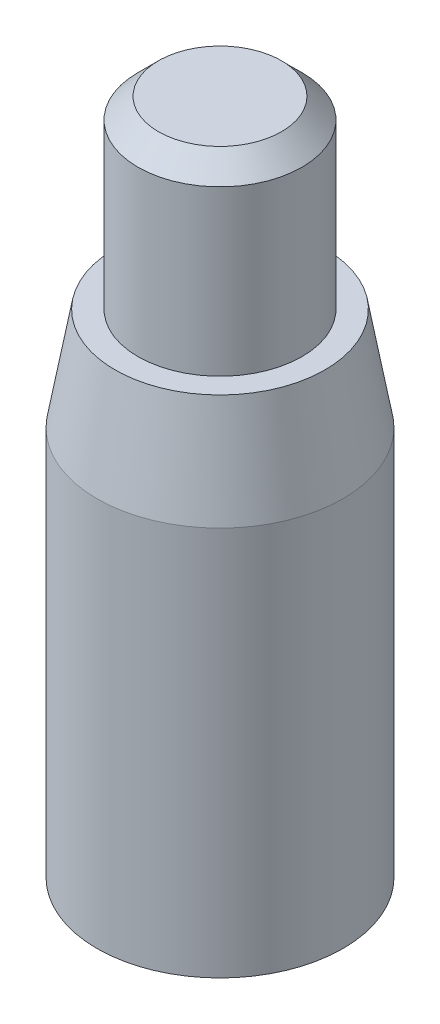
ISO-10303-21;
HEADER;
FILE_DESCRIPTION(('STEP AP214'),'2;1');
FILE_NAME('part.step','',(''),(''),'','','');
FILE_SCHEMA(('AUTOMOTIVE_DESIGN { 1 0 10303 214 1 1 1 1 }'));
ENDSEC;
DATA;
#1=APPLICATION_CONTEXT('core data for automotive mechanical design processes');
#2=APPLICATION_PROTOCOL_DEFINITION('international standard','automotive_design',2000,#1);
#3=PRODUCT_CONTEXT('',#1,'mechanical');
#4=PRODUCT('Part','Part','',(#3));
#5=PRODUCT_RELATED_PRODUCT_CATEGORY('part','',(#4));
#6=PRODUCT_DEFINITION_FORMATION('','',#4);
#7=PRODUCT_DEFINITION_CONTEXT('part definition',#1,'design');
#8=PRODUCT_DEFINITION('design','',#6,#7);
#9=PRODUCT_DEFINITION_SHAPE('','',#8);
#10=(LENGTH_UNIT() NAMED_UNIT(*) SI_UNIT(.MILLI.,.METRE.));
#11=(NAMED_UNIT(*) PLANE_ANGLE_UNIT() SI_UNIT($,.RADIAN.));
#12=(NAMED_UNIT(*) SI_UNIT($,.STERADIAN.) SOLID_ANGLE_UNIT());
#13=UNCERTAINTY_MEASURE_WITH_UNIT(LENGTH_MEASURE(1.E-05),#10,'distance_accuracy_value','');
#14=(GEOMETRIC_REPRESENTATION_CONTEXT(3) GLOBAL_UNCERTAINTY_ASSIGNED_CONTEXT((#13)) GLOBAL_UNIT_ASSIGNED_CONTEXT((#10,
#11,#12)) REPRESENTATION_CONTEXT('',''));
#15=CARTESIAN_POINT('',(0.,0.,0.));
#16=DIRECTION('',(0.,0.,1.));
#17=DIRECTION('',(1.,0.,0.));
#18=AXIS2_PLACEMENT_3D('',#15,#16,#17);
#19=CARTESIAN_POINT('',(0.,0.,0.));
#20=DIRECTION('',(0.,-1.,0.));
#21=DIRECTION('',(0.,0.,-1.));
#22=AXIS2_PLACEMENT_3D('',#19,#20,#21);
#23=PLANE('',#22);
#24=CARTESIAN_POINT('',(0.,0.,0.));
#25=DIRECTION('',(0.,-1.,0.));
#26=DIRECTION('',(0.,0.,-1.));
#27=AXIS2_PLACEMENT_3D('',#24,#25,#26);
#28=CIRCLE('',#27,6.);
#29=CARTESIAN_POINT('',(0.,0.,-6.));
#30=VERTEX_POINT('',#29);
#31=EDGE_CURVE('E47',#30,#30,#28,.T.);
#32=ORIENTED_EDGE('',*,*,#31,.T.);
#33=EDGE_LOOP('',(#32));
#34=FACE_BOUND('',#33,.T.);
#35=ADVANCED_FACE('F37',(#34),#23,.T.);
#36=CARTESIAN_POINT('',(0.,0.,0.));
#37=DIRECTION('',(0.,-1.,0.));
#38=DIRECTION('',(0.,0.,-1.));
#39=AXIS2_PLACEMENT_3D('',#36,#37,#38);
#40=CYLINDRICAL_SURFACE('',#39,6.);
#41=CARTESIAN_POINT('',(0.,19.,0.));
#42=DIRECTION('',(0.,-1.,0.));
#43=DIRECTION('',(0.,0.,-1.));
#44=AXIS2_PLACEMENT_3D('',#41,#42,#43);
#45=CIRCLE('',#44,6.);
#46=CARTESIAN_POINT('',(0.,19.,-6.));
#47=VERTEX_POINT('',#46);
#48=EDGE_CURVE('E51',#47,#47,#45,.T.);
#49=ORIENTED_EDGE('',*,*,#48,.T.);
#50=EDGE_LOOP('',(#49));
#51=FACE_BOUND('',#50,.T.);
#52=ORIENTED_EDGE('',*,*,#31,.F.);
#53=EDGE_LOOP('',(#52));
#54=FACE_BOUND('',#53,.T.);
#55=ADVANCED_FACE('F79',(#51,#54),#40,.T.);
#56=CARTESIAN_POINT('',(0.,19.,0.));
#57=DIRECTION('',(0.,-1.,0.));
#58=DIRECTION('',(0.,0.,-1.));
#59=AXIS2_PLACEMENT_3D('',#56,#57,#58);
#60=CONICAL_SURFACE('',#59,6.,0.174532925199434);
#61=CARTESIAN_POINT('',(0.,24.,0.));
#62=DIRECTION('',(0.,-1.,0.));
#63=DIRECTION('',(0.,0.,-1.));
#64=AXIS2_PLACEMENT_3D('',#61,#62,#63);
#65=CIRCLE('',#64,5.11836509645767);
#66=CARTESIAN_POINT('',(0.,24.,-5.11836509645767));
#67=VERTEX_POINT('',#66);
#68=EDGE_CURVE('E56',#67,#67,#65,.T.);
#69=ORIENTED_EDGE('',*,*,#68,.T.);
#70=EDGE_LOOP('',(#69));
#71=FACE_BOUND('',#70,.T.);
#72=ORIENTED_EDGE('',*,*,#48,.F.);
#73=EDGE_LOOP('',(#72));
#74=FACE_BOUND('',#73,.T.);
#75=ADVANCED_FACE('F76',(#71,#74),#60,.T.);
#76=CARTESIAN_POINT('',(4.00000000000001,24.,0.));
#77=DIRECTION('',(0.,1.,0.));
#78=DIRECTION('',(0.,0.,1.));
#79=AXIS2_PLACEMENT_3D('',#76,#77,#78);
#80=PLANE('',#79);
#81=CARTESIAN_POINT('',(0.,24.,0.));
#82=DIRECTION('',(0.,-1.,0.));
#83=DIRECTION('',(0.,0.,-1.));
#84=AXIS2_PLACEMENT_3D('',#81,#82,#83);
#85=CIRCLE('',#84,4.00000000000001);
#86=CARTESIAN_POINT('',(0.,24.,-4.00000000000001));
#87=VERTEX_POINT('',#86);
#88=EDGE_CURVE('E59',#87,#87,#85,.T.);
#89=ORIENTED_EDGE('',*,*,#88,.T.);
#90=EDGE_LOOP('',(#89));
#91=FACE_BOUND('',#90,.T.);
#92=ORIENTED_EDGE('',*,*,#68,.F.);
#93=EDGE_LOOP('',(#92));
#94=FACE_BOUND('',#93,.T.);
#95=ADVANCED_FACE('F63',(#91,#94),#80,.T.);
#96=CARTESIAN_POINT('',(0.,0.,0.));
#97=DIRECTION('',(0.,-1.,0.));
#98=DIRECTION('',(0.,0.,-1.));
#99=AXIS2_PLACEMENT_3D('',#96,#97,#98);
#100=CYLINDRICAL_SURFACE('',#99,4.00000000000001);
#101=CARTESIAN_POINT('',(0.,32.,0.));
#102=DIRECTION('',(0.,1.,0.));
#103=DIRECTION('',(0.,0.,1.));
#104=AXIS2_PLACEMENT_3D('',#101,#102,#103);
#105=CIRCLE('',#104,4.00000000000001);
#106=CARTESIAN_POINT('',(0.,32.,4.00000000000001));
#107=VERTEX_POINT('',#106);
#108=EDGE_CURVE('E43',#107,#107,#105,.F.);
#109=ORIENTED_EDGE('',*,*,#108,.T.);
#110=EDGE_LOOP('',(#109));
#111=FACE_BOUND('',#110,.T.);
#112=ORIENTED_EDGE('',*,*,#88,.F.);
#113=EDGE_LOOP('',(#112));
#114=FACE_BOUND('',#113,.T.);
#115=ADVANCED_FACE('F66',(#111,#114),#100,.T.);
#116=CARTESIAN_POINT('',(4.,33.,0.));
#117=DIRECTION('',(0.,1.,0.));
#118=DIRECTION('',(0.,0.,1.));
#119=AXIS2_PLACEMENT_3D('',#116,#117,#118);
#120=PLANE('',#119);
#121=CARTESIAN_POINT('',(0.,33.,0.));
#122=DIRECTION('',(0.,1.,0.));
#123=DIRECTION('',(0.,0.,1.));
#124=AXIS2_PLACEMENT_3D('',#121,#122,#123);
#125=CIRCLE('',#124,3.);
#126=CARTESIAN_POINT('',(0.,33.,3.));
#127=VERTEX_POINT('',#126);
#128=EDGE_CURVE('E10',#127,#127,#125,.T.);
#129=ORIENTED_EDGE('',*,*,#128,.T.);
#130=EDGE_LOOP('',(#129));
#131=FACE_BOUND('',#130,.T.);
#132=ADVANCED_FACE('F68',(#131),#120,.T.);
#133=CARTESIAN_POINT('',(0.,32.,0.));
#134=DIRECTION('',(0.,-1.,0.));
#135=DIRECTION('',(0.,0.,-1.));
#136=AXIS2_PLACEMENT_3D('',#133,#134,#135);
#137=CONICAL_SURFACE('',#136,4.00000000000001,0.785398163397456);
#138=ORIENTED_EDGE('',*,*,#128,.F.);
#139=EDGE_LOOP('',(#138));
#140=FACE_BOUND('',#139,.T.);
#141=ORIENTED_EDGE('',*,*,#108,.F.);
#142=EDGE_LOOP('',(#141));
#143=FACE_BOUND('',#142,.T.);
#144=ADVANCED_FACE('F74',(#140,#143),#137,.T.);
#145=CLOSED_SHELL('',(#35,#55,#75,#95,#115,#132,#144));
#146=MANIFOLD_SOLID_BREP('B2',#145);
#147=ADVANCED_BREP_SHAPE_REPRESENTATION('',(#18,#146),#14);
#148=SHAPE_DEFINITION_REPRESENTATION(#9,#147);
ENDSEC;
END-ISO-10303-21;
